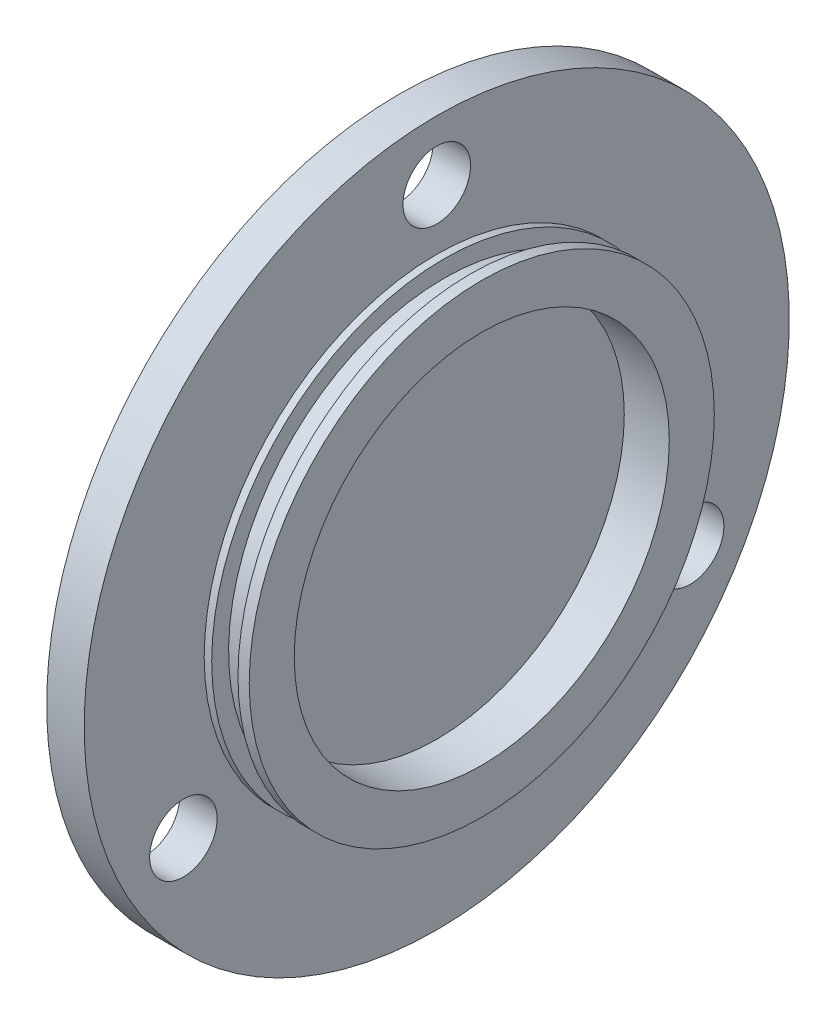
ISO-10303-21;
HEADER;
FILE_DESCRIPTION(('STEP AP214'),'2;1');
FILE_NAME('part.step','',(''),(''),'','','');
FILE_SCHEMA(('AUTOMOTIVE_DESIGN { 1 0 10303 214 1 1 1 1 }'));
ENDSEC;
DATA;
#1=APPLICATION_CONTEXT('core data for automotive mechanical design processes');
#2=APPLICATION_PROTOCOL_DEFINITION('international standard','automotive_design',2000,#1);
#3=PRODUCT_CONTEXT('',#1,'mechanical');
#4=PRODUCT('Part','Part','',(#3));
#5=PRODUCT_RELATED_PRODUCT_CATEGORY('part','',(#4));
#6=PRODUCT_DEFINITION_FORMATION('','',#4);
#7=PRODUCT_DEFINITION_CONTEXT('part definition',#1,'design');
#8=PRODUCT_DEFINITION('design','',#6,#7);
#9=PRODUCT_DEFINITION_SHAPE('','',#8);
#10=(LENGTH_UNIT() NAMED_UNIT(*) SI_UNIT(.MILLI.,.METRE.));
#11=(NAMED_UNIT(*) PLANE_ANGLE_UNIT() SI_UNIT($,.RADIAN.));
#12=(NAMED_UNIT(*) SI_UNIT($,.STERADIAN.) SOLID_ANGLE_UNIT());
#13=UNCERTAINTY_MEASURE_WITH_UNIT(LENGTH_MEASURE(1.E-05),#10,'distance_accuracy_value','');
#14=(GEOMETRIC_REPRESENTATION_CONTEXT(3) GLOBAL_UNCERTAINTY_ASSIGNED_CONTEXT((#13)) GLOBAL_UNIT_ASSIGNED_CONTEXT((#10,
#11,#12)) REPRESENTATION_CONTEXT('',''));
#15=CARTESIAN_POINT('',(0.,0.,0.));
#16=DIRECTION('',(0.,0.,1.));
#17=DIRECTION('',(1.,0.,0.));
#18=AXIS2_PLACEMENT_3D('',#15,#16,#17);
#19=CARTESIAN_POINT('',(0.,0.,0.));
#20=DIRECTION('',(-1.,0.,0.));
#21=DIRECTION('',(0.,-1.,0.));
#22=AXIS2_PLACEMENT_3D('',#19,#20,#21);
#23=PLANE('',#22);
#24=CARTESIAN_POINT('',(0.,39.,0.));
#25=DIRECTION('',(1.,0.,0.));
#26=DIRECTION('',(0.,1.,0.));
#27=AXIS2_PLACEMENT_3D('',#24,#25,#26);
#28=CIRCLE('',#27,4.5);
#29=CARTESIAN_POINT('',(0.,43.5,0.));
#30=VERTEX_POINT('',#29);
#31=EDGE_CURVE('E68',#30,#30,#28,.T.);
#32=ORIENTED_EDGE('',*,*,#31,.T.);
#33=EDGE_LOOP('',(#32));
#34=FACE_BOUND('',#33,.T.);
#35=CARTESIAN_POINT('',(0.,-19.499999999999,-33.7749907475948));
#36=DIRECTION('',(1.,0.,0.));
#37=DIRECTION('',(0.,1.,0.));
#38=AXIS2_PLACEMENT_3D('',#35,#36,#37);
#39=CIRCLE('',#38,4.5);
#40=CARTESIAN_POINT('',(0.,-14.999999999999,-33.7749907475948));
#41=VERTEX_POINT('',#40);
#42=EDGE_CURVE('E78',#41,#41,#39,.T.);
#43=ORIENTED_EDGE('',*,*,#42,.T.);
#44=EDGE_LOOP('',(#43));
#45=FACE_BOUND('',#44,.T.);
#46=CARTESIAN_POINT('',(0.,-19.500000000001,33.7749907475914));
#47=DIRECTION('',(1.,0.,0.));
#48=DIRECTION('',(0.,1.,0.));
#49=AXIS2_PLACEMENT_3D('',#46,#47,#48);
#50=CIRCLE('',#49,4.5);
#51=CARTESIAN_POINT('',(0.,-15.000000000001,33.7749907475914));
#52=VERTEX_POINT('',#51);
#53=EDGE_CURVE('E72',#52,#52,#50,.T.);
#54=ORIENTED_EDGE('',*,*,#53,.T.);
#55=EDGE_LOOP('',(#54));
#56=FACE_BOUND('',#55,.T.);
#57=CARTESIAN_POINT('',(0.,0.,0.));
#58=DIRECTION('',(1.,0.,0.));
#59=DIRECTION('',(0.,1.,0.));
#60=AXIS2_PLACEMENT_3D('',#57,#58,#59);
#61=CIRCLE('',#60,47.);
#62=CARTESIAN_POINT('',(0.,47.,0.));
#63=VERTEX_POINT('',#62);
#64=EDGE_CURVE('E10',#63,#63,#61,.T.);
#65=ORIENTED_EDGE('',*,*,#64,.F.);
#66=EDGE_LOOP('',(#65));
#67=FACE_BOUND('',#66,.T.);
#68=ADVANCED_FACE('F31',(#34,#45,#56,#67),#23,.T.);
#69=CARTESIAN_POINT('',(5.,0.,0.));
#70=DIRECTION('',(1.,0.,0.));
#71=DIRECTION('',(0.,1.,0.));
#72=AXIS2_PLACEMENT_3D('',#69,#70,#71);
#73=CYLINDRICAL_SURFACE('',#72,47.);
#74=ORIENTED_EDGE('',*,*,#64,.T.);
#75=EDGE_LOOP('',(#74));
#76=FACE_BOUND('',#75,.T.);
#77=CARTESIAN_POINT('',(5.00000000000002,0.,0.));
#78=DIRECTION('',(1.,0.,0.));
#79=DIRECTION('',(0.,1.,0.));
#80=AXIS2_PLACEMENT_3D('',#77,#78,#79);
#81=CIRCLE('',#80,47.);
#82=CARTESIAN_POINT('',(5.,47.,0.));
#83=VERTEX_POINT('',#82);
#84=EDGE_CURVE('E37',#83,#83,#81,.T.);
#85=ORIENTED_EDGE('',*,*,#84,.F.);
#86=EDGE_LOOP('',(#85));
#87=FACE_BOUND('',#86,.T.);
#88=ADVANCED_FACE('F100',(#76,#87),#73,.T.);
#89=CARTESIAN_POINT('',(5.,47.,0.));
#90=DIRECTION('',(1.,0.,0.));
#91=DIRECTION('',(0.,1.,0.));
#92=AXIS2_PLACEMENT_3D('',#89,#90,#91);
#93=PLANE('',#92);
#94=CARTESIAN_POINT('',(5.,39.,0.));
#95=DIRECTION('',(1.,0.,0.));
#96=DIRECTION('',(0.,1.,0.));
#97=AXIS2_PLACEMENT_3D('',#94,#95,#96);
#98=CIRCLE('',#97,4.5);
#99=CARTESIAN_POINT('',(5.,43.5,0.));
#100=VERTEX_POINT('',#99);
#101=EDGE_CURVE('E81',#100,#100,#98,.T.);
#102=ORIENTED_EDGE('',*,*,#101,.F.);
#103=EDGE_LOOP('',(#102));
#104=FACE_BOUND('',#103,.T.);
#105=CARTESIAN_POINT('',(5.00000000000002,-19.499999999999,-33.7749907475948));
#106=DIRECTION('',(1.,0.,0.));
#107=DIRECTION('',(0.,1.,0.));
#108=AXIS2_PLACEMENT_3D('',#105,#106,#107);
#109=CIRCLE('',#108,4.5);
#110=CARTESIAN_POINT('',(5.00000000000002,-14.999999999999,-33.7749907475948));
#111=VERTEX_POINT('',#110);
#112=EDGE_CURVE('E75',#111,#111,#109,.T.);
#113=ORIENTED_EDGE('',*,*,#112,.F.);
#114=EDGE_LOOP('',(#113));
#115=FACE_BOUND('',#114,.T.);
#116=CARTESIAN_POINT('',(5.00000000000002,-19.500000000001,33.7749907475914));
#117=DIRECTION('',(1.,0.,0.));
#118=DIRECTION('',(0.,1.,0.));
#119=AXIS2_PLACEMENT_3D('',#116,#117,#118);
#120=CIRCLE('',#119,4.5);
#121=CARTESIAN_POINT('',(5.00000000000002,-15.000000000001,33.7749907475914));
#122=VERTEX_POINT('',#121);
#123=EDGE_CURVE('E69',#122,#122,#120,.T.);
#124=ORIENTED_EDGE('',*,*,#123,.F.);
#125=EDGE_LOOP('',(#124));
#126=FACE_BOUND('',#125,.T.);
#127=ORIENTED_EDGE('',*,*,#84,.T.);
#128=EDGE_LOOP('',(#127));
#129=FACE_BOUND('',#128,.T.);
#130=CARTESIAN_POINT('',(5.00000000000001,0.,0.));
#131=DIRECTION('',(1.,0.,0.));
#132=DIRECTION('',(0.,1.,0.));
#133=AXIS2_PLACEMENT_3D('',#130,#131,#132);
#134=CIRCLE('',#133,31.);
#135=CARTESIAN_POINT('',(5.,31.,0.));
#136=VERTEX_POINT('',#135);
#137=EDGE_CURVE('E41',#136,#136,#134,.T.);
#138=ORIENTED_EDGE('',*,*,#137,.F.);
#139=EDGE_LOOP('',(#138));
#140=FACE_BOUND('',#139,.T.);
#141=ADVANCED_FACE('F96',(#104,#115,#126,#129,#140),#93,.T.);
#142=CARTESIAN_POINT('',(5.,0.,0.));
#143=DIRECTION('',(1.,0.,0.));
#144=DIRECTION('',(0.,1.,0.));
#145=AXIS2_PLACEMENT_3D('',#142,#143,#144);
#146=CYLINDRICAL_SURFACE('',#145,31.);
#147=ORIENTED_EDGE('',*,*,#137,.T.);
#148=EDGE_LOOP('',(#147));
#149=FACE_BOUND('',#148,.T.);
#150=CARTESIAN_POINT('',(6.00000000000001,0.,0.));
#151=DIRECTION('',(1.,0.,0.));
#152=DIRECTION('',(0.,1.,0.));
#153=AXIS2_PLACEMENT_3D('',#150,#151,#152);
#154=CIRCLE('',#153,31.);
#155=CARTESIAN_POINT('',(6.,31.,0.));
#156=VERTEX_POINT('',#155);
#157=EDGE_CURVE('E45',#156,#156,#154,.T.);
#158=ORIENTED_EDGE('',*,*,#157,.F.);
#159=EDGE_LOOP('',(#158));
#160=FACE_BOUND('',#159,.T.);
#161=ADVANCED_FACE('F99',(#149,#160),#146,.T.);
#162=CARTESIAN_POINT('',(6.,31.,0.));
#163=DIRECTION('',(1.,0.,0.));
#164=DIRECTION('',(0.,1.,0.));
#165=AXIS2_PLACEMENT_3D('',#162,#163,#164);
#166=PLANE('',#165);
#167=ORIENTED_EDGE('',*,*,#157,.T.);
#168=EDGE_LOOP('',(#167));
#169=FACE_BOUND('',#168,.T.);
#170=CARTESIAN_POINT('',(6.00000000000001,0.,0.));
#171=DIRECTION('',(1.,0.,0.));
#172=DIRECTION('',(0.,1.,0.));
#173=AXIS2_PLACEMENT_3D('',#170,#171,#172);
#174=CIRCLE('',#173,28.75);
#175=CARTESIAN_POINT('',(6.,28.75,0.));
#176=VERTEX_POINT('',#175);
#177=EDGE_CURVE('E50',#176,#176,#174,.T.);
#178=ORIENTED_EDGE('',*,*,#177,.F.);
#179=EDGE_LOOP('',(#178));
#180=FACE_BOUND('',#179,.T.);
#181=ADVANCED_FACE('F110',(#169,#180),#166,.T.);
#182=CARTESIAN_POINT('',(5.,0.,0.));
#183=DIRECTION('',(1.,0.,0.));
#184=DIRECTION('',(0.,1.,0.));
#185=AXIS2_PLACEMENT_3D('',#182,#183,#184);
#186=CYLINDRICAL_SURFACE('',#185,28.75);
#187=ORIENTED_EDGE('',*,*,#177,.T.);
#188=EDGE_LOOP('',(#187));
#189=FACE_BOUND('',#188,.T.);
#190=CARTESIAN_POINT('',(9.50000000000001,0.,0.));
#191=DIRECTION('',(1.,0.,0.));
#192=DIRECTION('',(0.,1.,0.));
#193=AXIS2_PLACEMENT_3D('',#190,#191,#192);
#194=CIRCLE('',#193,28.75);
#195=CARTESIAN_POINT('',(9.5,28.75,0.));
#196=VERTEX_POINT('',#195);
#197=EDGE_CURVE('E53',#196,#196,#194,.T.);
#198=ORIENTED_EDGE('',*,*,#197,.F.);
#199=EDGE_LOOP('',(#198));
#200=FACE_BOUND('',#199,.T.);
#201=ADVANCED_FACE('F116',(#189,#200),#186,.T.);
#202=CARTESIAN_POINT('',(9.5,28.75,0.));
#203=DIRECTION('',(-1.,0.,0.));
#204=DIRECTION('',(0.,-1.,0.));
#205=AXIS2_PLACEMENT_3D('',#202,#203,#204);
#206=PLANE('',#205);
#207=ORIENTED_EDGE('',*,*,#197,.T.);
#208=EDGE_LOOP('',(#207));
#209=FACE_BOUND('',#208,.T.);
#210=CARTESIAN_POINT('',(9.50000000000001,0.,0.));
#211=DIRECTION('',(1.,0.,0.));
#212=DIRECTION('',(0.,1.,0.));
#213=AXIS2_PLACEMENT_3D('',#210,#211,#212);
#214=CIRCLE('',#213,31.);
#215=CARTESIAN_POINT('',(9.5,31.,0.));
#216=VERTEX_POINT('',#215);
#217=EDGE_CURVE('E56',#216,#216,#214,.T.);
#218=ORIENTED_EDGE('',*,*,#217,.F.);
#219=EDGE_LOOP('',(#218));
#220=FACE_BOUND('',#219,.T.);
#221=ADVANCED_FACE('F122',(#209,#220),#206,.T.);
#222=CARTESIAN_POINT('',(5.,0.,0.));
#223=DIRECTION('',(1.,0.,0.));
#224=DIRECTION('',(0.,1.,0.));
#225=AXIS2_PLACEMENT_3D('',#222,#223,#224);
#226=CYLINDRICAL_SURFACE('',#225,31.);
#227=ORIENTED_EDGE('',*,*,#217,.T.);
#228=EDGE_LOOP('',(#227));
#229=FACE_BOUND('',#228,.T.);
#230=CARTESIAN_POINT('',(11.,0.,0.));
#231=DIRECTION('',(1.,0.,0.));
#232=DIRECTION('',(0.,1.,0.));
#233=AXIS2_PLACEMENT_3D('',#230,#231,#232);
#234=CIRCLE('',#233,31.);
#235=CARTESIAN_POINT('',(11.,31.,0.));
#236=VERTEX_POINT('',#235);
#237=EDGE_CURVE('E59',#236,#236,#234,.T.);
#238=ORIENTED_EDGE('',*,*,#237,.F.);
#239=EDGE_LOOP('',(#238));
#240=FACE_BOUND('',#239,.T.);
#241=ADVANCED_FACE('F128',(#229,#240),#226,.T.);
#242=CARTESIAN_POINT('',(11.,31.,0.));
#243=DIRECTION('',(1.,0.,0.));
#244=DIRECTION('',(0.,1.,0.));
#245=AXIS2_PLACEMENT_3D('',#242,#243,#244);
#246=PLANE('',#245);
#247=ORIENTED_EDGE('',*,*,#237,.T.);
#248=EDGE_LOOP('',(#247));
#249=FACE_BOUND('',#248,.T.);
#250=CARTESIAN_POINT('',(11.,0.,0.));
#251=DIRECTION('',(1.,0.,0.));
#252=DIRECTION('',(0.,1.,0.));
#253=AXIS2_PLACEMENT_3D('',#250,#251,#252);
#254=CIRCLE('',#253,25.);
#255=CARTESIAN_POINT('',(11.,25.,0.));
#256=VERTEX_POINT('',#255);
#257=EDGE_CURVE('E62',#256,#256,#254,.T.);
#258=ORIENTED_EDGE('',*,*,#257,.F.);
#259=EDGE_LOOP('',(#258));
#260=FACE_BOUND('',#259,.T.);
#261=ADVANCED_FACE('F134',(#249,#260),#246,.T.);
#262=CARTESIAN_POINT('',(5.,0.,0.));
#263=DIRECTION('',(1.,0.,0.));
#264=DIRECTION('',(0.,1.,0.));
#265=AXIS2_PLACEMENT_3D('',#262,#263,#264);
#266=CYLINDRICAL_SURFACE('',#265,25.);
#267=ORIENTED_EDGE('',*,*,#257,.T.);
#268=EDGE_LOOP('',(#267));
#269=FACE_BOUND('',#268,.T.);
#270=CARTESIAN_POINT('',(5.00000000000001,0.,0.));
#271=DIRECTION('',(1.,0.,0.));
#272=DIRECTION('',(0.,1.,0.));
#273=AXIS2_PLACEMENT_3D('',#270,#271,#272);
#274=CIRCLE('',#273,25.);
#275=CARTESIAN_POINT('',(5.,25.,0.));
#276=VERTEX_POINT('',#275);
#277=EDGE_CURVE('E65',#276,#276,#274,.T.);
#278=ORIENTED_EDGE('',*,*,#277,.F.);
#279=EDGE_LOOP('',(#278));
#280=FACE_BOUND('',#279,.T.);
#281=ADVANCED_FACE('F140',(#269,#280),#266,.F.);
#282=CARTESIAN_POINT('',(5.,25.,0.));
#283=DIRECTION('',(1.,0.,0.));
#284=DIRECTION('',(0.,1.,0.));
#285=AXIS2_PLACEMENT_3D('',#282,#283,#284);
#286=PLANE('',#285);
#287=ORIENTED_EDGE('',*,*,#277,.T.);
#288=EDGE_LOOP('',(#287));
#289=FACE_BOUND('',#288,.T.);
#290=ADVANCED_FACE('F146',(#289),#286,.T.);
#291=CARTESIAN_POINT('',(0.,-19.500000000001,33.7749907475914));
#292=DIRECTION('',(1.,0.,0.));
#293=DIRECTION('',(0.,1.,0.));
#294=AXIS2_PLACEMENT_3D('',#291,#292,#293);
#295=CYLINDRICAL_SURFACE('',#294,4.5);
#296=ORIENTED_EDGE('',*,*,#53,.F.);
#297=EDGE_LOOP('',(#296));
#298=FACE_BOUND('',#297,.T.);
#299=ORIENTED_EDGE('',*,*,#123,.T.);
#300=EDGE_LOOP('',(#299));
#301=FACE_BOUND('',#300,.T.);
#302=ADVANCED_FACE('F151',(#298,#301),#295,.F.);
#303=CARTESIAN_POINT('',(0.,-19.499999999999,-33.7749907475948));
#304=DIRECTION('',(1.,0.,0.));
#305=DIRECTION('',(0.,1.,0.));
#306=AXIS2_PLACEMENT_3D('',#303,#304,#305);
#307=CYLINDRICAL_SURFACE('',#306,4.5);
#308=ORIENTED_EDGE('',*,*,#42,.F.);
#309=EDGE_LOOP('',(#308));
#310=FACE_BOUND('',#309,.T.);
#311=ORIENTED_EDGE('',*,*,#112,.T.);
#312=EDGE_LOOP('',(#311));
#313=FACE_BOUND('',#312,.T.);
#314=ADVANCED_FACE('F92',(#310,#313),#307,.F.);
#315=CARTESIAN_POINT('',(0.,39.,0.));
#316=DIRECTION('',(1.,0.,0.));
#317=DIRECTION('',(0.,1.,0.));
#318=AXIS2_PLACEMENT_3D('',#315,#316,#317);
#319=CYLINDRICAL_SURFACE('',#318,4.5);
#320=ORIENTED_EDGE('',*,*,#31,.F.);
#321=EDGE_LOOP('',(#320));
#322=FACE_BOUND('',#321,.T.);
#323=ORIENTED_EDGE('',*,*,#101,.T.);
#324=EDGE_LOOP('',(#323));
#325=FACE_BOUND('',#324,.T.);
#326=ADVANCED_FACE('F89',(#322,#325),#319,.F.);
#327=CLOSED_SHELL('',(#68,#88,#141,#161,#181,#201,#221,#241,#261,#281,#290,#302,#314,#326));
#328=MANIFOLD_SOLID_BREP('B2',#327);
#329=ADVANCED_BREP_SHAPE_REPRESENTATION('',(#18,#328),#14);
#330=SHAPE_DEFINITION_REPRESENTATION(#9,#329);
ENDSEC;
END-ISO-10303-21;
